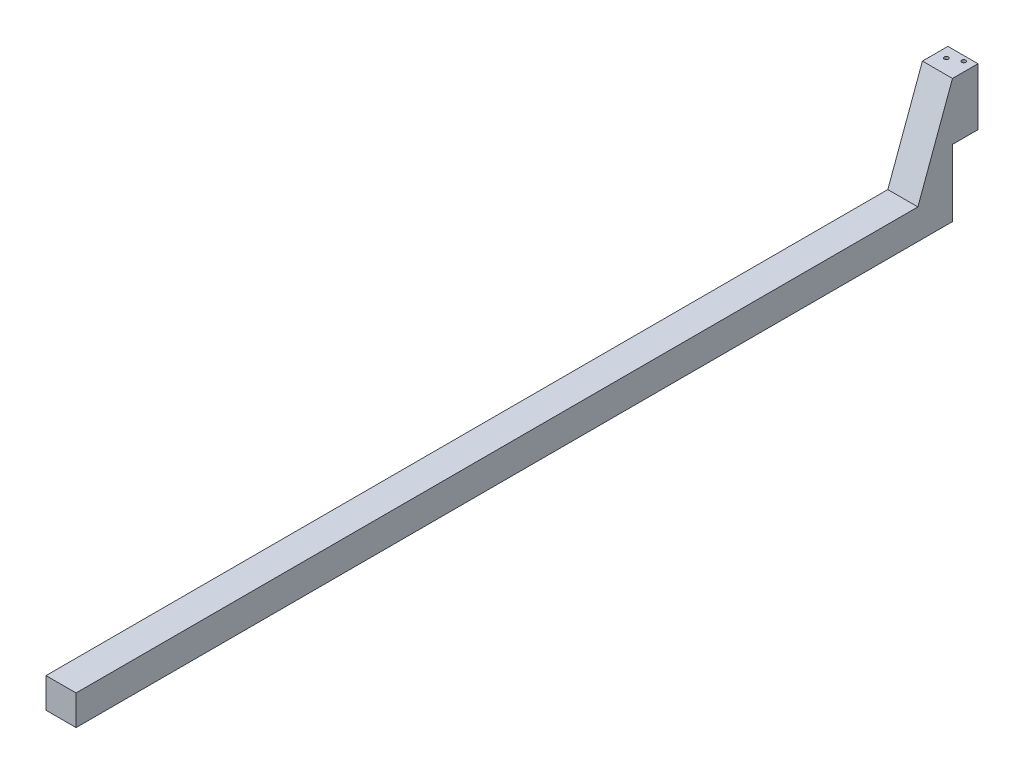
ISO-10303-21;
HEADER;
FILE_DESCRIPTION(('STEP AP214'),'2;1');
FILE_NAME('part.step','',(''),(''),'','','');
FILE_SCHEMA(('AUTOMOTIVE_DESIGN { 1 0 10303 214 1 1 1 1 }'));
ENDSEC;
DATA;
#1=APPLICATION_CONTEXT('core data for automotive mechanical design processes');
#2=APPLICATION_PROTOCOL_DEFINITION('international standard','automotive_design',2000,#1);
#3=PRODUCT_CONTEXT('',#1,'mechanical');
#4=PRODUCT('Part','Part','',(#3));
#5=PRODUCT_RELATED_PRODUCT_CATEGORY('part','',(#4));
#6=PRODUCT_DEFINITION_FORMATION('','',#4);
#7=PRODUCT_DEFINITION_CONTEXT('part definition',#1,'design');
#8=PRODUCT_DEFINITION('design','',#6,#7);
#9=PRODUCT_DEFINITION_SHAPE('','',#8);
#10=(LENGTH_UNIT() NAMED_UNIT(*) SI_UNIT(.MILLI.,.METRE.));
#11=(NAMED_UNIT(*) PLANE_ANGLE_UNIT() SI_UNIT($,.RADIAN.));
#12=(NAMED_UNIT(*) SI_UNIT($,.STERADIAN.) SOLID_ANGLE_UNIT());
#13=UNCERTAINTY_MEASURE_WITH_UNIT(LENGTH_MEASURE(1.E-05),#10,'distance_accuracy_value','');
#14=(GEOMETRIC_REPRESENTATION_CONTEXT(3) GLOBAL_UNCERTAINTY_ASSIGNED_CONTEXT((#13)) GLOBAL_UNIT_ASSIGNED_CONTEXT((#10,
#11,#12)) REPRESENTATION_CONTEXT('',''));
#15=CARTESIAN_POINT('',(0.,0.,0.));
#16=DIRECTION('',(0.,0.,1.));
#17=DIRECTION('',(1.,0.,0.));
#18=AXIS2_PLACEMENT_3D('',#15,#16,#17);
#19=CARTESIAN_POINT('',(-4.48275862068964,10.948275862069,600.));
#20=DIRECTION('',(1.,0.,0.));
#21=DIRECTION('',(0.,1.,0.));
#22=AXIS2_PLACEMENT_3D('',#19,#20,#21);
#23=PLANE('',#22);
#24=DIRECTION('',(0.,0.,-1.));
#25=VECTOR('',#24,1.);
#26=CARTESIAN_POINT('',(-4.48275862068963,-27.051724137931,16.9694869955634));
#27=LINE('',#26,#25);
#28=CARTESIAN_POINT('',(-4.48275862068963,-27.051724137931,16.9694869955634));
#29=VERTEX_POINT('',#28);
#30=CARTESIAN_POINT('',(-4.48275862068963,-27.051724137931,0.));
#31=VERTEX_POINT('',#30);
#32=EDGE_CURVE('E61',#29,#31,#27,.T.);
#33=ORIENTED_EDGE('',*,*,#32,.F.);
#34=DIRECTION('',(0.,1.,0.));
#35=VECTOR('',#34,1.);
#36=CARTESIAN_POINT('',(-4.48275862068963,-71.551724137931,16.9694869955634));
#37=LINE('',#36,#35);
#38=CARTESIAN_POINT('',(-4.48275862068963,-71.551724137931,16.9694869955634));
#39=VERTEX_POINT('',#38);
#40=EDGE_CURVE('E249',#39,#29,#37,.T.);
#41=ORIENTED_EDGE('',*,*,#40,.F.);
#42=DIRECTION('',(0.,0.,-1.));
#43=VECTOR('',#42,1.);
#44=CARTESIAN_POINT('',(-4.48275862068963,-71.551724137931,600.));
#45=LINE('',#44,#43);
#46=CARTESIAN_POINT('',(-4.48275862068963,-71.551724137931,600.));
#47=VERTEX_POINT('',#46);
#48=EDGE_CURVE('E54',#47,#39,#45,.T.);
#49=ORIENTED_EDGE('',*,*,#48,.F.);
#50=DIRECTION('',(0.,-1.,0.));
#51=VECTOR('',#50,1.);
#52=CARTESIAN_POINT('',(-4.48275862068964,10.948275862069,600.));
#53=LINE('',#52,#51);
#54=CARTESIAN_POINT('',(-4.48275862068963,-51.5517241379311,600.));
#55=VERTEX_POINT('',#54);
#56=EDGE_CURVE('E303',#55,#47,#53,.T.);
#57=ORIENTED_EDGE('',*,*,#56,.F.);
#58=DIRECTION('',(0.,0.,-1.));
#59=VECTOR('',#58,1.);
#60=CARTESIAN_POINT('',(-4.48275862068963,-51.5517241379311,0.));
#61=LINE('',#60,#59);
#62=CARTESIAN_POINT('',(-4.48275862068963,-51.5517241379311,39.9999999999999));
#63=VERTEX_POINT('',#62);
#64=EDGE_CURVE('E69',#55,#63,#61,.T.);
#65=ORIENTED_EDGE('',*,*,#64,.T.);
#66=DIRECTION('',(0.,0.93832267422143,-0.345760840816228));
#67=VECTOR('',#66,1.);
#68=CARTESIAN_POINT('',(-4.48275862068964,6.81437203156351,18.4927818104042));
#69=LINE('',#68,#67);
#70=CARTESIAN_POINT('',(-4.48275862068964,10.948275862069,16.9694869955634));
#71=VERTEX_POINT('',#70);
#72=EDGE_CURVE('E276',#63,#71,#69,.T.);
#73=ORIENTED_EDGE('',*,*,#72,.T.);
#74=DIRECTION('',(0.,0.,-1.));
#75=VECTOR('',#74,1.);
#76=CARTESIAN_POINT('',(-4.48275862068964,10.948275862069,600.));
#77=LINE('',#76,#75);
#78=CARTESIAN_POINT('',(-4.48275862068964,10.948275862069,0.));
#79=VERTEX_POINT('',#78);
#80=EDGE_CURVE('E314',#71,#79,#77,.T.);
#81=ORIENTED_EDGE('',*,*,#80,.T.);
#82=DIRECTION('',(0.,-1.,0.));
#83=VECTOR('',#82,1.);
#84=CARTESIAN_POINT('',(-4.48275862068964,10.948275862069,0.));
#85=LINE('',#84,#83);
#86=EDGE_CURVE('E299',#79,#31,#85,.T.);
#87=ORIENTED_EDGE('',*,*,#86,.T.);
#88=EDGE_LOOP('',(#33,#41,#49,#57,#65,#73,#81,#87));
#89=FACE_BOUND('',#88,.T.);
#90=ADVANCED_FACE('F45',(#89),#23,.F.);
#91=CARTESIAN_POINT('',(15.5172413793104,10.948275862069,600.));
#92=DIRECTION('',(-1.,0.,0.));
#93=DIRECTION('',(0.,-1.,0.));
#94=AXIS2_PLACEMENT_3D('',#91,#92,#93);
#95=PLANE('',#94);
#96=DIRECTION('',(0.,0.,-1.));
#97=VECTOR('',#96,1.);
#98=CARTESIAN_POINT('',(15.5172413793104,-71.551724137931,600.));
#99=LINE('',#98,#97);
#100=CARTESIAN_POINT('',(15.5172413793104,-71.551724137931,600.));
#101=VERTEX_POINT('',#100);
#102=CARTESIAN_POINT('',(15.5172413793103,-71.551724137931,16.9694869955634));
#103=VERTEX_POINT('',#102);
#104=EDGE_CURVE('E330',#101,#103,#99,.T.);
#105=ORIENTED_EDGE('',*,*,#104,.T.);
#106=DIRECTION('',(0.,1.,0.));
#107=VECTOR('',#106,1.);
#108=CARTESIAN_POINT('',(15.5172413793104,10.948275862069,16.9694869955634));
#109=LINE('',#108,#107);
#110=CARTESIAN_POINT('',(15.5172413793103,-27.051724137931,16.9694869955634));
#111=VERTEX_POINT('',#110);
#112=EDGE_CURVE('E272',#103,#111,#109,.T.);
#113=ORIENTED_EDGE('',*,*,#112,.T.);
#114=DIRECTION('',(0.,0.,-1.));
#115=VECTOR('',#114,1.);
#116=CARTESIAN_POINT('',(15.5172413793104,-27.051724137931,600.));
#117=LINE('',#116,#115);
#118=CARTESIAN_POINT('',(15.5172413793103,-27.051724137931,0.));
#119=VERTEX_POINT('',#118);
#120=EDGE_CURVE('E268',#111,#119,#117,.T.);
#121=ORIENTED_EDGE('',*,*,#120,.T.);
#122=DIRECTION('',(0.,1.,0.));
#123=VECTOR('',#122,1.);
#124=CARTESIAN_POINT('',(15.5172413793104,10.948275862069,0.));
#125=LINE('',#124,#123);
#126=CARTESIAN_POINT('',(15.5172413793104,10.948275862069,0.));
#127=VERTEX_POINT('',#126);
#128=EDGE_CURVE('E318',#119,#127,#125,.T.);
#129=ORIENTED_EDGE('',*,*,#128,.T.);
#130=DIRECTION('',(0.,0.,-1.));
#131=VECTOR('',#130,1.);
#132=CARTESIAN_POINT('',(15.5172413793104,10.948275862069,600.));
#133=LINE('',#132,#131);
#134=CARTESIAN_POINT('',(15.5172413793103,10.948275862069,16.9694869955634));
#135=VERTEX_POINT('',#134);
#136=EDGE_CURVE('E326',#135,#127,#133,.T.);
#137=ORIENTED_EDGE('',*,*,#136,.F.);
#138=DIRECTION('',(0.,0.93832267422143,-0.345760840816228));
#139=VECTOR('',#138,1.);
#140=CARTESIAN_POINT('',(15.5172413793104,-178.207366683663,86.6711107637556));
#141=LINE('',#140,#139);
#142=CARTESIAN_POINT('',(15.5172413793103,-51.5517241379311,39.9999999999999));
#143=VERTEX_POINT('',#142);
#144=EDGE_CURVE('E291',#143,#135,#141,.T.);
#145=ORIENTED_EDGE('',*,*,#144,.F.);
#146=DIRECTION('',(0.,0.,-1.));
#147=VECTOR('',#146,1.);
#148=CARTESIAN_POINT('',(15.5172413793104,-51.551724137931,600.));
#149=LINE('',#148,#147);
#150=CARTESIAN_POINT('',(15.5172413793103,-51.551724137931,600.));
#151=VERTEX_POINT('',#150);
#152=EDGE_CURVE('E286',#151,#143,#149,.T.);
#153=ORIENTED_EDGE('',*,*,#152,.F.);
#154=DIRECTION('',(0.,1.,0.));
#155=VECTOR('',#154,1.);
#156=CARTESIAN_POINT('',(15.5172413793104,10.948275862069,600.));
#157=LINE('',#156,#155);
#158=EDGE_CURVE('E310',#101,#151,#157,.T.);
#159=ORIENTED_EDGE('',*,*,#158,.F.);
#160=EDGE_LOOP('',(#105,#113,#121,#129,#137,#145,#153,#159));
#161=FACE_BOUND('',#160,.T.);
#162=ADVANCED_FACE('F349',(#161),#95,.F.);
#163=CARTESIAN_POINT('',(-4.48275862068964,10.948275862069,600.));
#164=DIRECTION('',(0.,-1.,0.));
#165=DIRECTION('',(0.,0.,-1.));
#166=AXIS2_PLACEMENT_3D('',#163,#164,#165);
#167=PLANE('',#166);
#168=CARTESIAN_POINT('',(1.70540528632713,10.948275862069,7.30324639880617));
#169=DIRECTION('',(0.,1.,0.));
#170=DIRECTION('',(0.,0.,1.));
#171=AXIS2_PLACEMENT_3D('',#168,#169,#170);
#172=CIRCLE('',#171,1.35);
#173=CARTESIAN_POINT('',(1.70540528632713,10.948275862069,8.65324639880617));
#174=VERTEX_POINT('',#173);
#175=EDGE_CURVE('E294',#174,#174,#172,.T.);
#176=ORIENTED_EDGE('',*,*,#175,.F.);
#177=EDGE_LOOP('',(#176));
#178=FACE_BOUND('',#177,.T.);
#179=CARTESIAN_POINT('',(9.32907747229359,10.948275862069,3.27209832674615));
#180=DIRECTION('',(0.,1.,0.));
#181=DIRECTION('',(0.,0.,1.));
#182=AXIS2_PLACEMENT_3D('',#179,#180,#181);
#183=CIRCLE('',#182,1.35);
#184=CARTESIAN_POINT('',(9.32907747229359,10.948275862069,4.62209832674615));
#185=VERTEX_POINT('',#184);
#186=EDGE_CURVE('E295',#185,#185,#183,.T.);
#187=ORIENTED_EDGE('',*,*,#186,.F.);
#188=EDGE_LOOP('',(#187));
#189=FACE_BOUND('',#188,.T.);
#190=DIRECTION('',(-1.,0.,0.));
#191=VECTOR('',#190,1.);
#192=CARTESIAN_POINT('',(595.51724137931,10.948275862069,16.9694869955634));
#193=LINE('',#192,#191);
#194=EDGE_CURVE('E283',#135,#71,#193,.T.);
#195=ORIENTED_EDGE('',*,*,#194,.F.);
#196=ORIENTED_EDGE('',*,*,#136,.T.);
#197=DIRECTION('',(-1.,0.,0.));
#198=VECTOR('',#197,1.);
#199=CARTESIAN_POINT('',(-4.48275862068964,10.948275862069,0.));
#200=LINE('',#199,#198);
#201=EDGE_CURVE('E307',#127,#79,#200,.T.);
#202=ORIENTED_EDGE('',*,*,#201,.T.);
#203=ORIENTED_EDGE('',*,*,#80,.F.);
#204=EDGE_LOOP('',(#195,#196,#202,#203));
#205=FACE_BOUND('',#204,.T.);
#206=ADVANCED_FACE('F365',(#178,#189,#205),#167,.F.);
#207=CARTESIAN_POINT('',(0.,0.,600.));
#208=DIRECTION('',(0.,0.,1.));
#209=DIRECTION('',(1.,0.,0.));
#210=AXIS2_PLACEMENT_3D('',#207,#208,#209);
#211=PLANE('',#210);
#212=ORIENTED_EDGE('',*,*,#158,.T.);
#213=DIRECTION('',(-1.,0.,0.));
#214=VECTOR('',#213,1.);
#215=CARTESIAN_POINT('',(0.,-51.551724137931,600.));
#216=LINE('',#215,#214);
#217=EDGE_CURVE('E11',#151,#55,#216,.T.);
#218=ORIENTED_EDGE('',*,*,#217,.T.);
#219=ORIENTED_EDGE('',*,*,#56,.T.);
#220=DIRECTION('',(1.,0.,0.));
#221=VECTOR('',#220,1.);
#222=CARTESIAN_POINT('',(-4.48275862068963,-71.551724137931,600.));
#223=LINE('',#222,#221);
#224=EDGE_CURVE('E306',#47,#101,#223,.T.);
#225=ORIENTED_EDGE('',*,*,#224,.T.);
#226=EDGE_LOOP('',(#212,#218,#219,#225));
#227=FACE_BOUND('',#226,.T.);
#228=ADVANCED_FACE('F355',(#227),#211,.T.);
#229=CARTESIAN_POINT('',(-4.48275862068963,-71.551724137931,600.));
#230=DIRECTION('',(0.,1.,0.));
#231=DIRECTION('',(0.,0.,1.));
#232=AXIS2_PLACEMENT_3D('',#229,#230,#231);
#233=PLANE('',#232);
#234=CARTESIAN_POINT('',(0.,-71.551724137931,224.909334592112));
#235=DIRECTION('',(0.,-1.,0.));
#236=DIRECTION('',(0.,0.,-1.));
#237=AXIS2_PLACEMENT_3D('',#234,#235,#236);
#238=CIRCLE('',#237,1.99999999999999);
#239=CARTESIAN_POINT('',(0.,-71.551724137931,222.909334592112));
#240=VERTEX_POINT('',#239);
#241=EDGE_CURVE('E156',#240,#240,#238,.T.);
#242=ORIENTED_EDGE('',*,*,#241,.F.);
#243=EDGE_LOOP('',(#242));
#244=FACE_BOUND('',#243,.T.);
#245=CARTESIAN_POINT('',(0.,-71.551724137931,239.909334592112));
#246=DIRECTION('',(0.,-1.,0.));
#247=DIRECTION('',(0.,0.,-1.));
#248=AXIS2_PLACEMENT_3D('',#245,#246,#247);
#249=CIRCLE('',#248,1.99999999999999);
#250=CARTESIAN_POINT('',(0.,-71.551724137931,237.909334592112));
#251=VERTEX_POINT('',#250);
#252=EDGE_CURVE('E155',#251,#251,#249,.T.);
#253=ORIENTED_EDGE('',*,*,#252,.F.);
#254=EDGE_LOOP('',(#253));
#255=FACE_BOUND('',#254,.T.);
#256=CARTESIAN_POINT('',(0.517241379310374,-71.551724137931,99.2462307032861));
#257=DIRECTION('',(0.,-1.,0.));
#258=DIRECTION('',(0.,0.,-1.));
#259=AXIS2_PLACEMENT_3D('',#256,#257,#258);
#260=CIRCLE('',#259,2.);
#261=CARTESIAN_POINT('',(0.517241379310374,-71.551724137931,97.2462307032861));
#262=VERTEX_POINT('',#261);
#263=EDGE_CURVE('E169',#262,#262,#260,.T.);
#264=ORIENTED_EDGE('',*,*,#263,.F.);
#265=EDGE_LOOP('',(#264));
#266=FACE_BOUND('',#265,.T.);
#267=CARTESIAN_POINT('',(0.517241379310374,-71.551724137931,84.2462307032861));
#268=DIRECTION('',(0.,-1.,0.));
#269=DIRECTION('',(0.,0.,-1.));
#270=AXIS2_PLACEMENT_3D('',#267,#268,#269);
#271=CIRCLE('',#270,2.);
#272=CARTESIAN_POINT('',(0.517241379310374,-71.551724137931,82.2462307032861));
#273=VERTEX_POINT('',#272);
#274=EDGE_CURVE('E177',#273,#273,#271,.T.);
#275=ORIENTED_EDGE('',*,*,#274,.F.);
#276=EDGE_LOOP('',(#275));
#277=FACE_BOUND('',#276,.T.);
#278=CARTESIAN_POINT('',(0.517241379310374,-71.551724137931,535.));
#279=DIRECTION('',(0.,-1.,0.));
#280=DIRECTION('',(0.,0.,-1.));
#281=AXIS2_PLACEMENT_3D('',#278,#279,#280);
#282=CIRCLE('',#281,2.);
#283=CARTESIAN_POINT('',(0.517241379310374,-71.551724137931,533.));
#284=VERTEX_POINT('',#283);
#285=EDGE_CURVE('E185',#284,#284,#282,.T.);
#286=ORIENTED_EDGE('',*,*,#285,.F.);
#287=EDGE_LOOP('',(#286));
#288=FACE_BOUND('',#287,.T.);
#289=CARTESIAN_POINT('',(0.517241379310374,-71.551724137931,550.));
#290=DIRECTION('',(0.,-1.,0.));
#291=DIRECTION('',(0.,0.,-1.));
#292=AXIS2_PLACEMENT_3D('',#289,#290,#291);
#293=CIRCLE('',#292,2.);
#294=CARTESIAN_POINT('',(0.517241379310374,-71.551724137931,548.));
#295=VERTEX_POINT('',#294);
#296=EDGE_CURVE('E193',#295,#295,#293,.T.);
#297=ORIENTED_EDGE('',*,*,#296,.F.);
#298=EDGE_LOOP('',(#297));
#299=FACE_BOUND('',#298,.T.);
#300=CARTESIAN_POINT('',(10.5172413793104,-71.551724137931,84.2462307032861));
#301=DIRECTION('',(0.,-1.,0.));
#302=DIRECTION('',(0.,0.,-1.));
#303=AXIS2_PLACEMENT_3D('',#300,#301,#302);
#304=CIRCLE('',#303,2.);
#305=CARTESIAN_POINT('',(10.5172413793104,-71.551724137931,82.2462307032861));
#306=VERTEX_POINT('',#305);
#307=EDGE_CURVE('E201',#306,#306,#304,.T.);
#308=ORIENTED_EDGE('',*,*,#307,.F.);
#309=EDGE_LOOP('',(#308));
#310=FACE_BOUND('',#309,.T.);
#311=CARTESIAN_POINT('',(10.5172413793104,-71.551724137931,99.2462307032861));
#312=DIRECTION('',(0.,-1.,0.));
#313=DIRECTION('',(0.,0.,-1.));
#314=AXIS2_PLACEMENT_3D('',#311,#312,#313);
#315=CIRCLE('',#314,2.);
#316=CARTESIAN_POINT('',(10.5172413793104,-71.551724137931,97.2462307032861));
#317=VERTEX_POINT('',#316);
#318=EDGE_CURVE('E209',#317,#317,#315,.T.);
#319=ORIENTED_EDGE('',*,*,#318,.F.);
#320=EDGE_LOOP('',(#319));
#321=FACE_BOUND('',#320,.T.);
#322=CARTESIAN_POINT('',(10.5172413793104,-71.551724137931,224.909334592112));
#323=DIRECTION('',(0.,-1.,0.));
#324=DIRECTION('',(0.,0.,-1.));
#325=AXIS2_PLACEMENT_3D('',#322,#323,#324);
#326=CIRCLE('',#325,2.);
#327=CARTESIAN_POINT('',(10.5172413793104,-71.551724137931,222.909334592112));
#328=VERTEX_POINT('',#327);
#329=EDGE_CURVE('E217',#328,#328,#326,.T.);
#330=ORIENTED_EDGE('',*,*,#329,.F.);
#331=EDGE_LOOP('',(#330));
#332=FACE_BOUND('',#331,.T.);
#333=CARTESIAN_POINT('',(10.5172413793104,-71.551724137931,239.909334592112));
#334=DIRECTION('',(0.,-1.,0.));
#335=DIRECTION('',(0.,0.,-1.));
#336=AXIS2_PLACEMENT_3D('',#333,#334,#335);
#337=CIRCLE('',#336,2.);
#338=CARTESIAN_POINT('',(10.5172413793104,-71.551724137931,237.909334592112));
#339=VERTEX_POINT('',#338);
#340=EDGE_CURVE('E225',#339,#339,#337,.T.);
#341=ORIENTED_EDGE('',*,*,#340,.F.);
#342=EDGE_LOOP('',(#341));
#343=FACE_BOUND('',#342,.T.);
#344=CARTESIAN_POINT('',(10.5172413793104,-71.551724137931,535.));
#345=DIRECTION('',(0.,-1.,0.));
#346=DIRECTION('',(0.,0.,-1.));
#347=AXIS2_PLACEMENT_3D('',#344,#345,#346);
#348=CIRCLE('',#347,2.);
#349=CARTESIAN_POINT('',(10.5172413793104,-71.551724137931,533.));
#350=VERTEX_POINT('',#349);
#351=EDGE_CURVE('E233',#350,#350,#348,.T.);
#352=ORIENTED_EDGE('',*,*,#351,.F.);
#353=EDGE_LOOP('',(#352));
#354=FACE_BOUND('',#353,.T.);
#355=CARTESIAN_POINT('',(10.5172413793104,-71.551724137931,550.));
#356=DIRECTION('',(0.,-1.,0.));
#357=DIRECTION('',(0.,0.,-1.));
#358=AXIS2_PLACEMENT_3D('',#355,#356,#357);
#359=CIRCLE('',#358,2.);
#360=CARTESIAN_POINT('',(10.5172413793104,-71.551724137931,548.));
#361=VERTEX_POINT('',#360);
#362=EDGE_CURVE('E241',#361,#361,#359,.T.);
#363=ORIENTED_EDGE('',*,*,#362,.F.);
#364=EDGE_LOOP('',(#363));
#365=FACE_BOUND('',#364,.T.);
#366=ORIENTED_EDGE('',*,*,#48,.T.);
#367=DIRECTION('',(-1.,0.,0.));
#368=VECTOR('',#367,1.);
#369=CARTESIAN_POINT('',(595.51724137931,-71.551724137931,16.9694869955634));
#370=LINE('',#369,#368);
#371=EDGE_CURVE('E256',#103,#39,#370,.T.);
#372=ORIENTED_EDGE('',*,*,#371,.F.);
#373=ORIENTED_EDGE('',*,*,#104,.F.);
#374=ORIENTED_EDGE('',*,*,#224,.F.);
#375=EDGE_LOOP('',(#366,#372,#373,#374));
#376=FACE_BOUND('',#375,.T.);
#377=ADVANCED_FACE('F340',(#244,#255,#266,#277,#288,#299,#310,#321,#332,#343,#354,#365,#376),
#233,.F.);
#378=CARTESIAN_POINT('',(0.,0.,0.));
#379=DIRECTION('',(0.,0.,1.));
#380=DIRECTION('',(1.,0.,0.));
#381=AXIS2_PLACEMENT_3D('',#378,#379,#380);
#382=PLANE('',#381);
#383=ORIENTED_EDGE('',*,*,#128,.F.);
#384=DIRECTION('',(-1.,0.,0.));
#385=VECTOR('',#384,1.);
#386=CARTESIAN_POINT('',(595.51724137931,-27.051724137931,0.));
#387=LINE('',#386,#385);
#388=EDGE_CURVE('E259',#119,#31,#387,.T.);
#389=ORIENTED_EDGE('',*,*,#388,.T.);
#390=ORIENTED_EDGE('',*,*,#86,.F.);
#391=ORIENTED_EDGE('',*,*,#201,.F.);
#392=EDGE_LOOP('',(#383,#389,#390,#391));
#393=FACE_BOUND('',#392,.T.);
#394=ADVANCED_FACE('F369',(#393),#382,.F.);
#395=CARTESIAN_POINT('',(1.70540528632713,-589.051724137931,7.30324639880617));
#396=DIRECTION('',(0.,1.,0.));
#397=DIRECTION('',(0.,0.,1.));
#398=AXIS2_PLACEMENT_3D('',#395,#396,#397);
#399=CYLINDRICAL_SURFACE('',#398,1.35);
#400=CARTESIAN_POINT('',(1.70540528632713,-27.0517241379311,7.30324639880617));
#401=DIRECTION('',(0.,1.,0.));
#402=DIRECTION('',(-1.,0.,0.));
#403=AXIS2_PLACEMENT_3D('',#400,#401,#402);
#404=CIRCLE('',#403,1.35);
#405=CARTESIAN_POINT('',(0.355405286327131,-27.0517241379311,7.30324639880617));
#406=VERTEX_POINT('',#405);
#407=EDGE_CURVE('E264',#406,#406,#404,.F.);
#408=ORIENTED_EDGE('',*,*,#407,.T.);
#409=EDGE_LOOP('',(#408));
#410=FACE_BOUND('',#409,.T.);
#411=ORIENTED_EDGE('',*,*,#175,.T.);
#412=EDGE_LOOP('',(#411));
#413=FACE_BOUND('',#412,.T.);
#414=ADVANCED_FACE('F402',(#410,#413),#399,.F.);
#415=CARTESIAN_POINT('',(9.32907747229359,-589.051724137931,3.27209832674615));
#416=DIRECTION('',(0.,1.,0.));
#417=DIRECTION('',(0.,0.,1.));
#418=AXIS2_PLACEMENT_3D('',#415,#416,#417);
#419=CYLINDRICAL_SURFACE('',#418,1.35);
#420=CARTESIAN_POINT('',(9.32907747229359,-27.0517241379311,3.27209832674615));
#421=DIRECTION('',(0.,1.,0.));
#422=DIRECTION('',(-1.,0.,0.));
#423=AXIS2_PLACEMENT_3D('',#420,#421,#422);
#424=CIRCLE('',#423,1.35);
#425=CARTESIAN_POINT('',(7.97907747229359,-27.0517241379311,3.27209832674615));
#426=VERTEX_POINT('',#425);
#427=EDGE_CURVE('E48',#426,#426,#424,.F.);
#428=ORIENTED_EDGE('',*,*,#427,.T.);
#429=EDGE_LOOP('',(#428));
#430=FACE_BOUND('',#429,.T.);
#431=ORIENTED_EDGE('',*,*,#186,.T.);
#432=EDGE_LOOP('',(#431));
#433=FACE_BOUND('',#432,.T.);
#434=ADVANCED_FACE('F641',(#430,#433),#419,.F.);
#435=CARTESIAN_POINT('',(595.51724137931,6.81437203156358,18.4927818104042));
#436=DIRECTION('',(0.,0.345760840816228,0.93832267422143));
#437=DIRECTION('',(0.,-0.93832267422143,0.345760840816228));
#438=AXIS2_PLACEMENT_3D('',#435,#436,#437);
#439=PLANE('',#438);
#440=ORIENTED_EDGE('',*,*,#144,.T.);
#441=ORIENTED_EDGE('',*,*,#194,.T.);
#442=ORIENTED_EDGE('',*,*,#72,.F.);
#443=DIRECTION('',(-1.,0.,0.));
#444=VECTOR('',#443,1.);
#445=CARTESIAN_POINT('',(595.51724137931,-51.551724137931,39.9999999999999));
#446=LINE('',#445,#444);
#447=EDGE_CURVE('E282',#143,#63,#446,.T.);
#448=ORIENTED_EDGE('',*,*,#447,.F.);
#449=EDGE_LOOP('',(#440,#441,#442,#448));
#450=FACE_BOUND('',#449,.T.);
#451=ADVANCED_FACE('F360',(#450),#439,.T.);
#452=CARTESIAN_POINT('',(595.51724137931,-51.551724137931,0.));
#453=DIRECTION('',(0.,1.,0.));
#454=DIRECTION('',(-1.,0.,0.));
#455=AXIS2_PLACEMENT_3D('',#452,#453,#454);
#456=PLANE('',#455);
#457=ORIENTED_EDGE('',*,*,#152,.T.);
#458=ORIENTED_EDGE('',*,*,#447,.T.);
#459=ORIENTED_EDGE('',*,*,#64,.F.);
#460=ORIENTED_EDGE('',*,*,#217,.F.);
#461=EDGE_LOOP('',(#457,#458,#459,#460));
#462=FACE_BOUND('',#461,.T.);
#463=ADVANCED_FACE('F356',(#462),#456,.T.);
#464=CARTESIAN_POINT('',(595.51724137931,-71.551724137931,16.9694869955634));
#465=DIRECTION('',(0.,0.,1.));
#466=DIRECTION('',(1.,0.,0.));
#467=AXIS2_PLACEMENT_3D('',#464,#465,#466);
#468=PLANE('',#467);
#469=ORIENTED_EDGE('',*,*,#371,.T.);
#470=ORIENTED_EDGE('',*,*,#40,.T.);
#471=DIRECTION('',(-1.,0.,0.));
#472=VECTOR('',#471,1.);
#473=CARTESIAN_POINT('',(595.51724137931,-27.051724137931,16.9694869955634));
#474=LINE('',#473,#472);
#475=EDGE_CURVE('E255',#111,#29,#474,.T.);
#476=ORIENTED_EDGE('',*,*,#475,.F.);
#477=ORIENTED_EDGE('',*,*,#112,.F.);
#478=EDGE_LOOP('',(#469,#470,#476,#477));
#479=FACE_BOUND('',#478,.T.);
#480=ADVANCED_FACE('F347',(#479),#468,.F.);
#481=CARTESIAN_POINT('',(595.51724137931,-27.051724137931,16.9694869955634));
#482=DIRECTION('',(0.,1.,0.));
#483=DIRECTION('',(-1.,0.,0.));
#484=AXIS2_PLACEMENT_3D('',#481,#482,#483);
#485=PLANE('',#484);
#486=ORIENTED_EDGE('',*,*,#427,.F.);
#487=EDGE_LOOP('',(#486));
#488=FACE_BOUND('',#487,.T.);
#489=ORIENTED_EDGE('',*,*,#407,.F.);
#490=EDGE_LOOP('',(#489));
#491=FACE_BOUND('',#490,.T.);
#492=ORIENTED_EDGE('',*,*,#475,.T.);
#493=ORIENTED_EDGE('',*,*,#32,.T.);
#494=ORIENTED_EDGE('',*,*,#388,.F.);
#495=ORIENTED_EDGE('',*,*,#120,.F.);
#496=EDGE_LOOP('',(#492,#493,#494,#495));
#497=FACE_BOUND('',#496,.T.);
#498=ADVANCED_FACE('F370',(#488,#491,#497),#485,.F.);
#499=CARTESIAN_POINT('',(10.5172413793104,-57.551724137931,550.));
#500=DIRECTION('',(0.,-1.,0.));
#501=DIRECTION('',(0.,0.,-1.));
#502=AXIS2_PLACEMENT_3D('',#499,#500,#501);
#503=CONICAL_SURFACE('',#502,2.,1.02974425867665);
#504=CARTESIAN_POINT('',(10.5172413793104,-56.3500028998759,550.));
#505=VERTEX_POINT('',#504);
#506=VERTEX_LOOP('',#505);
#507=FACE_BOUND('',#506,.T.);
#508=CARTESIAN_POINT('',(10.5172413793104,-57.551724137931,550.));
#509=DIRECTION('',(0.,-1.,0.));
#510=DIRECTION('',(0.,0.,-1.));
#511=AXIS2_PLACEMENT_3D('',#508,#509,#510);
#512=CIRCLE('',#511,2.);
#513=CARTESIAN_POINT('',(10.5172413793104,-57.551724137931,548.));
#514=VERTEX_POINT('',#513);
#515=EDGE_CURVE('E245',#514,#514,#512,.T.);
#516=ORIENTED_EDGE('',*,*,#515,.T.);
#517=EDGE_LOOP('',(#516));
#518=FACE_BOUND('',#517,.T.);
#519=ADVANCED_FACE('F372',(#507,#518),#503,.F.);
#520=CARTESIAN_POINT('',(10.5172413793104,-71.551724137931,550.));
#521=DIRECTION('',(0.,-1.,0.));
#522=DIRECTION('',(0.,0.,-1.));
#523=AXIS2_PLACEMENT_3D('',#520,#521,#522);
#524=CYLINDRICAL_SURFACE('',#523,2.);
#525=ORIENTED_EDGE('',*,*,#515,.F.);
#526=EDGE_LOOP('',(#525));
#527=FACE_BOUND('',#526,.T.);
#528=ORIENTED_EDGE('',*,*,#362,.T.);
#529=EDGE_LOOP('',(#528));
#530=FACE_BOUND('',#529,.T.);
#531=ADVANCED_FACE('F379',(#527,#530),#524,.F.);
#532=CARTESIAN_POINT('',(10.5172413793104,-57.551724137931,535.));
#533=DIRECTION('',(0.,-1.,0.));
#534=DIRECTION('',(0.,0.,-1.));
#535=AXIS2_PLACEMENT_3D('',#532,#533,#534);
#536=CONICAL_SURFACE('',#535,2.,1.02974425867665);
#537=CARTESIAN_POINT('',(10.5172413793104,-56.3500028998759,535.));
#538=VERTEX_POINT('',#537);
#539=VERTEX_LOOP('',#538);
#540=FACE_BOUND('',#539,.T.);
#541=CARTESIAN_POINT('',(10.5172413793104,-57.551724137931,535.));
#542=DIRECTION('',(0.,-1.,0.));
#543=DIRECTION('',(0.,0.,-1.));
#544=AXIS2_PLACEMENT_3D('',#541,#542,#543);
#545=CIRCLE('',#544,2.);
#546=CARTESIAN_POINT('',(10.5172413793104,-57.551724137931,533.));
#547=VERTEX_POINT('',#546);
#548=EDGE_CURVE('E237',#547,#547,#545,.T.);
#549=ORIENTED_EDGE('',*,*,#548,.T.);
#550=EDGE_LOOP('',(#549));
#551=FACE_BOUND('',#550,.T.);
#552=ADVANCED_FACE('F429',(#540,#551),#536,.F.);
#553=CARTESIAN_POINT('',(10.5172413793104,-71.551724137931,535.));
#554=DIRECTION('',(0.,-1.,0.));
#555=DIRECTION('',(0.,0.,-1.));
#556=AXIS2_PLACEMENT_3D('',#553,#554,#555);
#557=CYLINDRICAL_SURFACE('',#556,2.);
#558=ORIENTED_EDGE('',*,*,#548,.F.);
#559=EDGE_LOOP('',(#558));
#560=FACE_BOUND('',#559,.T.);
#561=ORIENTED_EDGE('',*,*,#351,.T.);
#562=EDGE_LOOP('',(#561));
#563=FACE_BOUND('',#562,.T.);
#564=ADVANCED_FACE('F435',(#560,#563),#557,.F.);
#565=CARTESIAN_POINT('',(10.5172413793104,-57.551724137931,239.909334592112));
#566=DIRECTION('',(0.,-1.,0.));
#567=DIRECTION('',(0.,0.,-1.));
#568=AXIS2_PLACEMENT_3D('',#565,#566,#567);
#569=CONICAL_SURFACE('',#568,2.,1.02974425867665);
#570=CARTESIAN_POINT('',(10.5172413793104,-56.3500028998759,239.909334592112));
#571=VERTEX_POINT('',#570);
#572=VERTEX_LOOP('',#571);
#573=FACE_BOUND('',#572,.T.);
#574=CARTESIAN_POINT('',(10.5172413793104,-57.551724137931,239.909334592112));
#575=DIRECTION('',(0.,-1.,0.));
#576=DIRECTION('',(0.,0.,-1.));
#577=AXIS2_PLACEMENT_3D('',#574,#575,#576);
#578=CIRCLE('',#577,2.);
#579=CARTESIAN_POINT('',(10.5172413793104,-57.551724137931,237.909334592112));
#580=VERTEX_POINT('',#579);
#581=EDGE_CURVE('E229',#580,#580,#578,.T.);
#582=ORIENTED_EDGE('',*,*,#581,.T.);
#583=EDGE_LOOP('',(#582));
#584=FACE_BOUND('',#583,.T.);
#585=ADVANCED_FACE('F442',(#573,#584),#569,.F.);
#586=CARTESIAN_POINT('',(10.5172413793104,-71.551724137931,239.909334592112));
#587=DIRECTION('',(0.,-1.,0.));
#588=DIRECTION('',(0.,0.,-1.));
#589=AXIS2_PLACEMENT_3D('',#586,#587,#588);
#590=CYLINDRICAL_SURFACE('',#589,2.);
#591=ORIENTED_EDGE('',*,*,#581,.F.);
#592=EDGE_LOOP('',(#591));
#593=FACE_BOUND('',#592,.T.);
#594=ORIENTED_EDGE('',*,*,#340,.T.);
#595=EDGE_LOOP('',(#594));
#596=FACE_BOUND('',#595,.T.);
#597=ADVANCED_FACE('F446',(#593,#596),#590,.F.);
#598=CARTESIAN_POINT('',(10.5172413793104,-57.551724137931,224.909334592112));
#599=DIRECTION('',(0.,-1.,0.));
#600=DIRECTION('',(0.,0.,-1.));
#601=AXIS2_PLACEMENT_3D('',#598,#599,#600);
#602=CONICAL_SURFACE('',#601,2.,1.02974425867665);
#603=CARTESIAN_POINT('',(10.5172413793104,-56.3500028998759,224.909334592112));
#604=VERTEX_POINT('',#603);
#605=VERTEX_LOOP('',#604);
#606=FACE_BOUND('',#605,.T.);
#607=CARTESIAN_POINT('',(10.5172413793104,-57.551724137931,224.909334592112));
#608=DIRECTION('',(0.,-1.,0.));
#609=DIRECTION('',(0.,0.,-1.));
#610=AXIS2_PLACEMENT_3D('',#607,#608,#609);
#611=CIRCLE('',#610,2.);
#612=CARTESIAN_POINT('',(10.5172413793104,-57.551724137931,222.909334592112));
#613=VERTEX_POINT('',#612);
#614=EDGE_CURVE('E221',#613,#613,#611,.T.);
#615=ORIENTED_EDGE('',*,*,#614,.T.);
#616=EDGE_LOOP('',(#615));
#617=FACE_BOUND('',#616,.T.);
#618=ADVANCED_FACE('F450',(#606,#617),#602,.F.);
#619=CARTESIAN_POINT('',(10.5172413793104,-71.551724137931,224.909334592112));
#620=DIRECTION('',(0.,-1.,0.));
#621=DIRECTION('',(0.,0.,-1.));
#622=AXIS2_PLACEMENT_3D('',#619,#620,#621);
#623=CYLINDRICAL_SURFACE('',#622,2.);
#624=ORIENTED_EDGE('',*,*,#614,.F.);
#625=EDGE_LOOP('',(#624));
#626=FACE_BOUND('',#625,.T.);
#627=ORIENTED_EDGE('',*,*,#329,.T.);
#628=EDGE_LOOP('',(#627));
#629=FACE_BOUND('',#628,.T.);
#630=ADVANCED_FACE('F454',(#626,#629),#623,.F.);
#631=CARTESIAN_POINT('',(10.5172413793104,-57.551724137931,99.2462307032861));
#632=DIRECTION('',(0.,-1.,0.));
#633=DIRECTION('',(0.,0.,-1.));
#634=AXIS2_PLACEMENT_3D('',#631,#632,#633);
#635=CONICAL_SURFACE('',#634,2.,1.02974425867665);
#636=CARTESIAN_POINT('',(10.5172413793104,-56.3500028998759,99.2462307032861));
#637=VERTEX_POINT('',#636);
#638=VERTEX_LOOP('',#637);
#639=FACE_BOUND('',#638,.T.);
#640=CARTESIAN_POINT('',(10.5172413793104,-57.551724137931,99.2462307032861));
#641=DIRECTION('',(0.,-1.,0.));
#642=DIRECTION('',(0.,0.,-1.));
#643=AXIS2_PLACEMENT_3D('',#640,#641,#642);
#644=CIRCLE('',#643,2.);
#645=CARTESIAN_POINT('',(10.5172413793104,-57.551724137931,97.2462307032861));
#646=VERTEX_POINT('',#645);
#647=EDGE_CURVE('E213',#646,#646,#644,.T.);
#648=ORIENTED_EDGE('',*,*,#647,.T.);
#649=EDGE_LOOP('',(#648));
#650=FACE_BOUND('',#649,.T.);
#651=ADVANCED_FACE('F458',(#639,#650),#635,.F.);
#652=CARTESIAN_POINT('',(10.5172413793104,-71.551724137931,99.2462307032861));
#653=DIRECTION('',(0.,-1.,0.));
#654=DIRECTION('',(0.,0.,-1.));
#655=AXIS2_PLACEMENT_3D('',#652,#653,#654);
#656=CYLINDRICAL_SURFACE('',#655,2.);
#657=ORIENTED_EDGE('',*,*,#647,.F.);
#658=EDGE_LOOP('',(#657));
#659=FACE_BOUND('',#658,.T.);
#660=ORIENTED_EDGE('',*,*,#318,.T.);
#661=EDGE_LOOP('',(#660));
#662=FACE_BOUND('',#661,.T.);
#663=ADVANCED_FACE('F462',(#659,#662),#656,.F.);
#664=CARTESIAN_POINT('',(10.5172413793104,-57.551724137931,84.2462307032861));
#665=DIRECTION('',(0.,-1.,0.));
#666=DIRECTION('',(0.,0.,-1.));
#667=AXIS2_PLACEMENT_3D('',#664,#665,#666);
#668=CONICAL_SURFACE('',#667,2.,1.02974425867665);
#669=CARTESIAN_POINT('',(10.5172413793104,-56.3500028998759,84.2462307032861));
#670=VERTEX_POINT('',#669);
#671=VERTEX_LOOP('',#670);
#672=FACE_BOUND('',#671,.T.);
#673=CARTESIAN_POINT('',(10.5172413793104,-57.551724137931,84.2462307032861));
#674=DIRECTION('',(0.,-1.,0.));
#675=DIRECTION('',(0.,0.,-1.));
#676=AXIS2_PLACEMENT_3D('',#673,#674,#675);
#677=CIRCLE('',#676,2.);
#678=CARTESIAN_POINT('',(10.5172413793104,-57.551724137931,82.2462307032861));
#679=VERTEX_POINT('',#678);
#680=EDGE_CURVE('E205',#679,#679,#677,.T.);
#681=ORIENTED_EDGE('',*,*,#680,.T.);
#682=EDGE_LOOP('',(#681));
#683=FACE_BOUND('',#682,.T.);
#684=ADVANCED_FACE('F466',(#672,#683),#668,.F.);
#685=CARTESIAN_POINT('',(10.5172413793104,-71.551724137931,84.2462307032861));
#686=DIRECTION('',(0.,-1.,0.));
#687=DIRECTION('',(0.,0.,-1.));
#688=AXIS2_PLACEMENT_3D('',#685,#686,#687);
#689=CYLINDRICAL_SURFACE('',#688,2.);
#690=ORIENTED_EDGE('',*,*,#680,.F.);
#691=EDGE_LOOP('',(#690));
#692=FACE_BOUND('',#691,.T.);
#693=ORIENTED_EDGE('',*,*,#307,.T.);
#694=EDGE_LOOP('',(#693));
#695=FACE_BOUND('',#694,.T.);
#696=ADVANCED_FACE('F470',(#692,#695),#689,.F.);
#697=CARTESIAN_POINT('',(0.517241379310374,-57.551724137931,550.));
#698=DIRECTION('',(0.,-1.,0.));
#699=DIRECTION('',(0.,0.,-1.));
#700=AXIS2_PLACEMENT_3D('',#697,#698,#699);
#701=CONICAL_SURFACE('',#700,2.,1.02974425867665);
#702=CARTESIAN_POINT('',(0.51724137931037,-56.3500028998759,550.));
#703=VERTEX_POINT('',#702);
#704=VERTEX_LOOP('',#703);
#705=FACE_BOUND('',#704,.T.);
#706=CARTESIAN_POINT('',(0.517241379310374,-57.551724137931,550.));
#707=DIRECTION('',(0.,-1.,0.));
#708=DIRECTION('',(0.,0.,-1.));
#709=AXIS2_PLACEMENT_3D('',#706,#707,#708);
#710=CIRCLE('',#709,2.);
#711=CARTESIAN_POINT('',(0.517241379310374,-57.551724137931,548.));
#712=VERTEX_POINT('',#711);
#713=EDGE_CURVE('E197',#712,#712,#710,.T.);
#714=ORIENTED_EDGE('',*,*,#713,.T.);
#715=EDGE_LOOP('',(#714));
#716=FACE_BOUND('',#715,.T.);
#717=ADVANCED_FACE('F474',(#705,#716),#701,.F.);
#718=CARTESIAN_POINT('',(0.517241379310374,-71.551724137931,550.));
#719=DIRECTION('',(0.,-1.,0.));
#720=DIRECTION('',(0.,0.,-1.));
#721=AXIS2_PLACEMENT_3D('',#718,#719,#720);
#722=CYLINDRICAL_SURFACE('',#721,2.);
#723=ORIENTED_EDGE('',*,*,#713,.F.);
#724=EDGE_LOOP('',(#723));
#725=FACE_BOUND('',#724,.T.);
#726=ORIENTED_EDGE('',*,*,#296,.T.);
#727=EDGE_LOOP('',(#726));
#728=FACE_BOUND('',#727,.T.);
#729=ADVANCED_FACE('F478',(#725,#728),#722,.F.);
#730=CARTESIAN_POINT('',(0.517241379310374,-57.551724137931,535.));
#731=DIRECTION('',(0.,-1.,0.));
#732=DIRECTION('',(0.,0.,-1.));
#733=AXIS2_PLACEMENT_3D('',#730,#731,#732);
#734=CONICAL_SURFACE('',#733,2.,1.02974425867665);
#735=CARTESIAN_POINT('',(0.51724137931037,-56.3500028998759,535.));
#736=VERTEX_POINT('',#735);
#737=VERTEX_LOOP('',#736);
#738=FACE_BOUND('',#737,.T.);
#739=CARTESIAN_POINT('',(0.517241379310374,-57.551724137931,535.));
#740=DIRECTION('',(0.,-1.,0.));
#741=DIRECTION('',(0.,0.,-1.));
#742=AXIS2_PLACEMENT_3D('',#739,#740,#741);
#743=CIRCLE('',#742,2.);
#744=CARTESIAN_POINT('',(0.517241379310374,-57.551724137931,533.));
#745=VERTEX_POINT('',#744);
#746=EDGE_CURVE('E189',#745,#745,#743,.T.);
#747=ORIENTED_EDGE('',*,*,#746,.T.);
#748=EDGE_LOOP('',(#747));
#749=FACE_BOUND('',#748,.T.);
#750=ADVANCED_FACE('F482',(#738,#749),#734,.F.);
#751=CARTESIAN_POINT('',(0.517241379310374,-71.551724137931,535.));
#752=DIRECTION('',(0.,-1.,0.));
#753=DIRECTION('',(0.,0.,-1.));
#754=AXIS2_PLACEMENT_3D('',#751,#752,#753);
#755=CYLINDRICAL_SURFACE('',#754,2.);
#756=ORIENTED_EDGE('',*,*,#746,.F.);
#757=EDGE_LOOP('',(#756));
#758=FACE_BOUND('',#757,.T.);
#759=ORIENTED_EDGE('',*,*,#285,.T.);
#760=EDGE_LOOP('',(#759));
#761=FACE_BOUND('',#760,.T.);
#762=ADVANCED_FACE('F486',(#758,#761),#755,.F.);
#763=CARTESIAN_POINT('',(0.517241379310374,-57.551724137931,84.2462307032861));
#764=DIRECTION('',(0.,-1.,0.));
#765=DIRECTION('',(0.,0.,-1.));
#766=AXIS2_PLACEMENT_3D('',#763,#764,#765);
#767=CONICAL_SURFACE('',#766,2.,1.02974425867665);
#768=CARTESIAN_POINT('',(0.51724137931037,-56.3500028998759,84.2462307032861));
#769=VERTEX_POINT('',#768);
#770=VERTEX_LOOP('',#769);
#771=FACE_BOUND('',#770,.T.);
#772=CARTESIAN_POINT('',(0.517241379310374,-57.551724137931,84.2462307032861));
#773=DIRECTION('',(0.,-1.,0.));
#774=DIRECTION('',(0.,0.,-1.));
#775=AXIS2_PLACEMENT_3D('',#772,#773,#774);
#776=CIRCLE('',#775,2.);
#777=CARTESIAN_POINT('',(0.517241379310374,-57.551724137931,82.2462307032861));
#778=VERTEX_POINT('',#777);
#779=EDGE_CURVE('E181',#778,#778,#776,.T.);
#780=ORIENTED_EDGE('',*,*,#779,.T.);
#781=EDGE_LOOP('',(#780));
#782=FACE_BOUND('',#781,.T.);
#783=ADVANCED_FACE('F490',(#771,#782),#767,.F.);
#784=CARTESIAN_POINT('',(0.517241379310374,-71.551724137931,84.2462307032861));
#785=DIRECTION('',(0.,-1.,0.));
#786=DIRECTION('',(0.,0.,-1.));
#787=AXIS2_PLACEMENT_3D('',#784,#785,#786);
#788=CYLINDRICAL_SURFACE('',#787,2.);
#789=ORIENTED_EDGE('',*,*,#779,.F.);
#790=EDGE_LOOP('',(#789));
#791=FACE_BOUND('',#790,.T.);
#792=ORIENTED_EDGE('',*,*,#274,.T.);
#793=EDGE_LOOP('',(#792));
#794=FACE_BOUND('',#793,.T.);
#795=ADVANCED_FACE('F494',(#791,#794),#788,.F.);
#796=CARTESIAN_POINT('',(0.517241379310374,-57.551724137931,99.2462307032861));
#797=DIRECTION('',(0.,-1.,0.));
#798=DIRECTION('',(0.,0.,-1.));
#799=AXIS2_PLACEMENT_3D('',#796,#797,#798);
#800=CONICAL_SURFACE('',#799,2.,1.02974425867665);
#801=CARTESIAN_POINT('',(0.51724137931037,-56.3500028998759,99.2462307032861));
#802=VERTEX_POINT('',#801);
#803=VERTEX_LOOP('',#802);
#804=FACE_BOUND('',#803,.T.);
#805=CARTESIAN_POINT('',(0.517241379310374,-57.551724137931,99.2462307032861));
#806=DIRECTION('',(0.,-1.,0.));
#807=DIRECTION('',(0.,0.,-1.));
#808=AXIS2_PLACEMENT_3D('',#805,#806,#807);
#809=CIRCLE('',#808,2.);
#810=CARTESIAN_POINT('',(0.517241379310374,-57.551724137931,97.2462307032861));
#811=VERTEX_POINT('',#810);
#812=EDGE_CURVE('E173',#811,#811,#809,.T.);
#813=ORIENTED_EDGE('',*,*,#812,.T.);
#814=EDGE_LOOP('',(#813));
#815=FACE_BOUND('',#814,.T.);
#816=ADVANCED_FACE('F498',(#804,#815),#800,.F.);
#817=CARTESIAN_POINT('',(0.517241379310374,-71.551724137931,99.2462307032861));
#818=DIRECTION('',(0.,-1.,0.));
#819=DIRECTION('',(0.,0.,-1.));
#820=AXIS2_PLACEMENT_3D('',#817,#818,#819);
#821=CYLINDRICAL_SURFACE('',#820,2.);
#822=ORIENTED_EDGE('',*,*,#812,.F.);
#823=EDGE_LOOP('',(#822));
#824=FACE_BOUND('',#823,.T.);
#825=ORIENTED_EDGE('',*,*,#263,.T.);
#826=EDGE_LOOP('',(#825));
#827=FACE_BOUND('',#826,.T.);
#828=ADVANCED_FACE('F502',(#824,#827),#821,.F.);
#829=CARTESIAN_POINT('',(0.,-57.551724137931,239.909334592112));
#830=DIRECTION('',(0.,-1.,0.));
#831=DIRECTION('',(0.,0.,-1.));
#832=AXIS2_PLACEMENT_3D('',#829,#830,#831);
#833=CONICAL_SURFACE('',#832,1.99999999999999,1.02974425867665);
#834=CARTESIAN_POINT('',(0.,-56.3500028998759,239.909334592112));
#835=VERTEX_POINT('',#834);
#836=VERTEX_LOOP('',#835);
#837=FACE_BOUND('',#836,.T.);
#838=CARTESIAN_POINT('',(0.,-57.551724137931,239.909334592112));
#839=DIRECTION('',(0.,-1.,0.));
#840=DIRECTION('',(0.,0.,-1.));
#841=AXIS2_PLACEMENT_3D('',#838,#839,#840);
#842=CIRCLE('',#841,1.99999999999999);
#843=CARTESIAN_POINT('',(0.,-57.551724137931,237.909334592112));
#844=VERTEX_POINT('',#843);
#845=EDGE_CURVE('E161',#844,#844,#842,.T.);
#846=ORIENTED_EDGE('',*,*,#845,.T.);
#847=EDGE_LOOP('',(#846));
#848=FACE_BOUND('',#847,.T.);
#849=ADVANCED_FACE('F506',(#837,#848),#833,.F.);
#850=CARTESIAN_POINT('',(0.,-71.551724137931,239.909334592112));
#851=DIRECTION('',(0.,-1.,0.));
#852=DIRECTION('',(0.,0.,-1.));
#853=AXIS2_PLACEMENT_3D('',#850,#851,#852);
#854=CYLINDRICAL_SURFACE('',#853,1.99999999999999);
#855=ORIENTED_EDGE('',*,*,#845,.F.);
#856=EDGE_LOOP('',(#855));
#857=FACE_BOUND('',#856,.T.);
#858=ORIENTED_EDGE('',*,*,#252,.T.);
#859=EDGE_LOOP('',(#858));
#860=FACE_BOUND('',#859,.T.);
#861=ADVANCED_FACE('F148',(#857,#860),#854,.F.);
#862=CARTESIAN_POINT('',(0.,-57.551724137931,224.909334592112));
#863=DIRECTION('',(0.,-1.,0.));
#864=DIRECTION('',(0.,0.,-1.));
#865=AXIS2_PLACEMENT_3D('',#862,#863,#864);
#866=CONICAL_SURFACE('',#865,1.99999999999999,1.02974425867665);
#867=CARTESIAN_POINT('',(0.,-56.3500028998759,224.909334592112));
#868=VERTEX_POINT('',#867);
#869=VERTEX_LOOP('',#868);
#870=FACE_BOUND('',#869,.T.);
#871=CARTESIAN_POINT('',(0.,-57.551724137931,224.909334592112));
#872=DIRECTION('',(0.,-1.,0.));
#873=DIRECTION('',(0.,0.,-1.));
#874=AXIS2_PLACEMENT_3D('',#871,#872,#873);
#875=CIRCLE('',#874,1.99999999999999);
#876=CARTESIAN_POINT('',(0.,-57.551724137931,222.909334592112));
#877=VERTEX_POINT('',#876);
#878=EDGE_CURVE('E152',#877,#877,#875,.T.);
#879=ORIENTED_EDGE('',*,*,#878,.T.);
#880=EDGE_LOOP('',(#879));
#881=FACE_BOUND('',#880,.T.);
#882=ADVANCED_FACE('F144',(#870,#881),#866,.F.);
#883=CARTESIAN_POINT('',(0.,-71.551724137931,224.909334592112));
#884=DIRECTION('',(0.,-1.,0.));
#885=DIRECTION('',(0.,0.,-1.));
#886=AXIS2_PLACEMENT_3D('',#883,#884,#885);
#887=CYLINDRICAL_SURFACE('',#886,1.99999999999999);
#888=ORIENTED_EDGE('',*,*,#878,.F.);
#889=EDGE_LOOP('',(#888));
#890=FACE_BOUND('',#889,.T.);
#891=ORIENTED_EDGE('',*,*,#241,.T.);
#892=EDGE_LOOP('',(#891));
#893=FACE_BOUND('',#892,.T.);
#894=ADVANCED_FACE('F147',(#890,#893),#887,.F.);
#895=CLOSED_SHELL('',(#90,#162,#206,#228,#377,#394,#414,#434,#451,#463,#480,#498,#519,#531,#552,
#564,#585,#597,#618,#630,#651,#663,#684,#696,#717,#729,#750,#762,#783,#795,#816,#828,#849,#861,
#882,#894));
#896=MANIFOLD_SOLID_BREP('B2',#895);
#897=ADVANCED_BREP_SHAPE_REPRESENTATION('',(#18,#896),#14);
#898=SHAPE_DEFINITION_REPRESENTATION(#9,#897);
ENDSEC;
END-ISO-10303-21;
